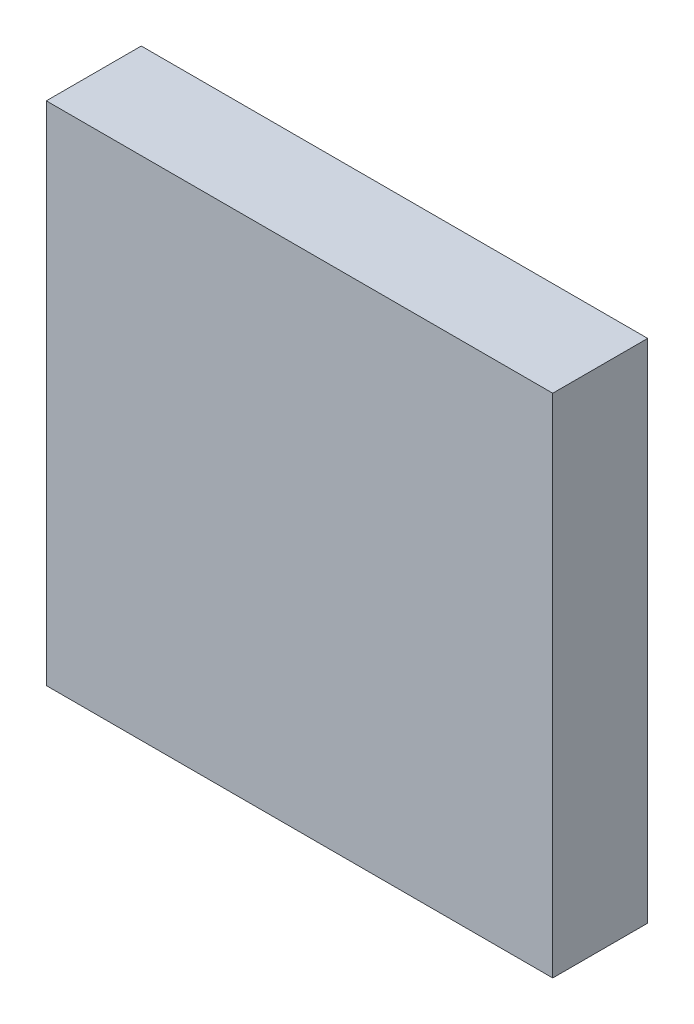
ISO-10303-21;
HEADER;
FILE_DESCRIPTION(('STEP AP214'),'2;1');
FILE_NAME('part.step','',(''),(''),'','','');
FILE_SCHEMA(('AUTOMOTIVE_DESIGN { 1 0 10303 214 1 1 1 1 }'));
ENDSEC;
DATA;
#1=APPLICATION_CONTEXT('core data for automotive mechanical design processes');
#2=APPLICATION_PROTOCOL_DEFINITION('international standard','automotive_design',2000,#1);
#3=PRODUCT_CONTEXT('',#1,'mechanical');
#4=PRODUCT('Part','Part','',(#3));
#5=PRODUCT_RELATED_PRODUCT_CATEGORY('part','',(#4));
#6=PRODUCT_DEFINITION_FORMATION('','',#4);
#7=PRODUCT_DEFINITION_CONTEXT('part definition',#1,'design');
#8=PRODUCT_DEFINITION('design','',#6,#7);
#9=PRODUCT_DEFINITION_SHAPE('','',#8);
#10=(LENGTH_UNIT() NAMED_UNIT(*) SI_UNIT(.MILLI.,.METRE.));
#11=(NAMED_UNIT(*) PLANE_ANGLE_UNIT() SI_UNIT($,.RADIAN.));
#12=(NAMED_UNIT(*) SI_UNIT($,.STERADIAN.) SOLID_ANGLE_UNIT());
#13=UNCERTAINTY_MEASURE_WITH_UNIT(LENGTH_MEASURE(1.E-05),#10,'distance_accuracy_value','');
#14=(GEOMETRIC_REPRESENTATION_CONTEXT(3) GLOBAL_UNCERTAINTY_ASSIGNED_CONTEXT((#13)) GLOBAL_UNIT_ASSIGNED_CONTEXT((#10,
#11,#12)) REPRESENTATION_CONTEXT('',''));
#15=CARTESIAN_POINT('',(0.,0.,0.));
#16=DIRECTION('',(0.,0.,1.));
#17=DIRECTION('',(1.,0.,0.));
#18=AXIS2_PLACEMENT_3D('',#15,#16,#17);
#19=CARTESIAN_POINT('',(0.,0.,19.05));
#20=DIRECTION('',(1.,0.,0.));
#21=DIRECTION('',(0.,0.,-1.));
#22=AXIS2_PLACEMENT_3D('',#19,#20,#21);
#23=PLANE('',#22);
#24=DIRECTION('',(0.,-1.,0.));
#25=VECTOR('',#24,1.);
#26=CARTESIAN_POINT('',(0.,0.,0.));
#27=LINE('',#26,#25);
#28=CARTESIAN_POINT('',(0.,101.6,0.));
#29=VERTEX_POINT('',#28);
#30=CARTESIAN_POINT('',(0.,0.,0.));
#31=VERTEX_POINT('',#30);
#32=EDGE_CURVE('E104',#29,#31,#27,.T.);
#33=ORIENTED_EDGE('',*,*,#32,.T.);
#34=DIRECTION('',(0.,0.,-1.));
#35=VECTOR('',#34,1.);
#36=CARTESIAN_POINT('',(0.,0.,19.05));
#37=LINE('',#36,#35);
#38=CARTESIAN_POINT('',(0.,0.,19.05));
#39=VERTEX_POINT('',#38);
#40=EDGE_CURVE('E12',#39,#31,#37,.T.);
#41=ORIENTED_EDGE('',*,*,#40,.F.);
#42=DIRECTION('',(0.,-1.,0.));
#43=VECTOR('',#42,1.);
#44=CARTESIAN_POINT('',(0.,0.,19.05));
#45=LINE('',#44,#43);
#46=CARTESIAN_POINT('',(0.,101.6,19.05));
#47=VERTEX_POINT('',#46);
#48=EDGE_CURVE('E91',#47,#39,#45,.T.);
#49=ORIENTED_EDGE('',*,*,#48,.F.);
#50=DIRECTION('',(0.,0.,-1.));
#51=VECTOR('',#50,1.);
#52=CARTESIAN_POINT('',(0.,101.6,19.05));
#53=LINE('',#52,#51);
#54=EDGE_CURVE('E100',#47,#29,#53,.T.);
#55=ORIENTED_EDGE('',*,*,#54,.T.);
#56=EDGE_LOOP('',(#33,#41,#49,#55));
#57=FACE_BOUND('',#56,.T.);
#58=ADVANCED_FACE('F40',(#57),#23,.F.);
#59=CARTESIAN_POINT('',(0.,0.,19.05));
#60=DIRECTION('',(0.,1.,0.));
#61=DIRECTION('',(0.,0.,1.));
#62=AXIS2_PLACEMENT_3D('',#59,#60,#61);
#63=PLANE('',#62);
#64=DIRECTION('',(1.,0.,0.));
#65=VECTOR('',#64,1.);
#66=CARTESIAN_POINT('',(0.,0.,0.));
#67=LINE('',#66,#65);
#68=CARTESIAN_POINT('',(101.6,0.,0.));
#69=VERTEX_POINT('',#68);
#70=EDGE_CURVE('E95',#31,#69,#67,.T.);
#71=ORIENTED_EDGE('',*,*,#70,.T.);
#72=DIRECTION('',(0.,0.,-1.));
#73=VECTOR('',#72,1.);
#74=CARTESIAN_POINT('',(101.6,0.,19.05));
#75=LINE('',#74,#73);
#76=CARTESIAN_POINT('',(101.6,0.,19.05));
#77=VERTEX_POINT('',#76);
#78=EDGE_CURVE('E48',#77,#69,#75,.T.);
#79=ORIENTED_EDGE('',*,*,#78,.F.);
#80=DIRECTION('',(1.,0.,0.));
#81=VECTOR('',#80,1.);
#82=CARTESIAN_POINT('',(0.,0.,19.05));
#83=LINE('',#82,#81);
#84=EDGE_CURVE('E86',#39,#77,#83,.T.);
#85=ORIENTED_EDGE('',*,*,#84,.F.);
#86=ORIENTED_EDGE('',*,*,#40,.T.);
#87=EDGE_LOOP('',(#71,#79,#85,#86));
#88=FACE_BOUND('',#87,.T.);
#89=ADVANCED_FACE('F94',(#88),#63,.F.);
#90=CARTESIAN_POINT('',(101.6,0.,19.05));
#91=DIRECTION('',(-1.,0.,0.));
#92=DIRECTION('',(0.,0.,1.));
#93=AXIS2_PLACEMENT_3D('',#90,#91,#92);
#94=PLANE('',#93);
#95=DIRECTION('',(0.,1.,0.));
#96=VECTOR('',#95,1.);
#97=CARTESIAN_POINT('',(101.6,0.,0.));
#98=LINE('',#97,#96);
#99=CARTESIAN_POINT('',(101.6,101.6,0.));
#100=VERTEX_POINT('',#99);
#101=EDGE_CURVE('E73',#69,#100,#98,.T.);
#102=ORIENTED_EDGE('',*,*,#101,.T.);
#103=DIRECTION('',(0.,0.,-1.));
#104=VECTOR('',#103,1.);
#105=CARTESIAN_POINT('',(101.6,101.6,19.05));
#106=LINE('',#105,#104);
#107=CARTESIAN_POINT('',(101.6,101.6,19.05));
#108=VERTEX_POINT('',#107);
#109=EDGE_CURVE('E96',#108,#100,#106,.T.);
#110=ORIENTED_EDGE('',*,*,#109,.F.);
#111=DIRECTION('',(0.,1.,0.));
#112=VECTOR('',#111,1.);
#113=CARTESIAN_POINT('',(101.6,0.,19.05));
#114=LINE('',#113,#112);
#115=EDGE_CURVE('E89',#77,#108,#114,.T.);
#116=ORIENTED_EDGE('',*,*,#115,.F.);
#117=ORIENTED_EDGE('',*,*,#78,.T.);
#118=EDGE_LOOP('',(#102,#110,#116,#117));
#119=FACE_BOUND('',#118,.T.);
#120=ADVANCED_FACE('F97',(#119),#94,.F.);
#121=CARTESIAN_POINT('',(0.,101.6,19.05));
#122=DIRECTION('',(0.,-1.,0.));
#123=DIRECTION('',(0.,0.,-1.));
#124=AXIS2_PLACEMENT_3D('',#121,#122,#123);
#125=PLANE('',#124);
#126=DIRECTION('',(-1.,0.,0.));
#127=VECTOR('',#126,1.);
#128=CARTESIAN_POINT('',(0.,101.6,0.));
#129=LINE('',#128,#127);
#130=EDGE_CURVE('E79',#100,#29,#129,.T.);
#131=ORIENTED_EDGE('',*,*,#130,.T.);
#132=ORIENTED_EDGE('',*,*,#54,.F.);
#133=DIRECTION('',(-1.,0.,0.));
#134=VECTOR('',#133,1.);
#135=CARTESIAN_POINT('',(0.,101.6,19.05));
#136=LINE('',#135,#134);
#137=EDGE_CURVE('E56',#108,#47,#136,.T.);
#138=ORIENTED_EDGE('',*,*,#137,.F.);
#139=ORIENTED_EDGE('',*,*,#109,.T.);
#140=EDGE_LOOP('',(#131,#132,#138,#139));
#141=FACE_BOUND('',#140,.T.);
#142=ADVANCED_FACE('F111',(#141),#125,.F.);
#143=CARTESIAN_POINT('',(0.,0.,19.05));
#144=DIRECTION('',(0.,0.,-1.));
#145=DIRECTION('',(-1.,0.,0.));
#146=AXIS2_PLACEMENT_3D('',#143,#144,#145);
#147=PLANE('',#146);
#148=ORIENTED_EDGE('',*,*,#48,.T.);
#149=ORIENTED_EDGE('',*,*,#84,.T.);
#150=ORIENTED_EDGE('',*,*,#115,.T.);
#151=ORIENTED_EDGE('',*,*,#137,.T.);
#152=EDGE_LOOP('',(#148,#149,#150,#151));
#153=FACE_BOUND('',#152,.T.);
#154=ADVANCED_FACE('F87',(#153),#147,.F.);
#155=CARTESIAN_POINT('',(0.,0.,0.));
#156=DIRECTION('',(0.,0.,-1.));
#157=DIRECTION('',(-1.,0.,0.));
#158=AXIS2_PLACEMENT_3D('',#155,#156,#157);
#159=PLANE('',#158);
#160=ORIENTED_EDGE('',*,*,#32,.F.);
#161=ORIENTED_EDGE('',*,*,#130,.F.);
#162=ORIENTED_EDGE('',*,*,#101,.F.);
#163=ORIENTED_EDGE('',*,*,#70,.F.);
#164=EDGE_LOOP('',(#160,#161,#162,#163));
#165=FACE_BOUND('',#164,.T.);
#166=ADVANCED_FACE('F114',(#165),#159,.T.);
#167=CLOSED_SHELL('',(#58,#89,#120,#142,#154,#166));
#168=MANIFOLD_SOLID_BREP('B2',#167);
#169=ADVANCED_BREP_SHAPE_REPRESENTATION('',(#18,#168),#14);
#170=SHAPE_DEFINITION_REPRESENTATION(#9,#169);
ENDSEC;
END-ISO-10303-21;
